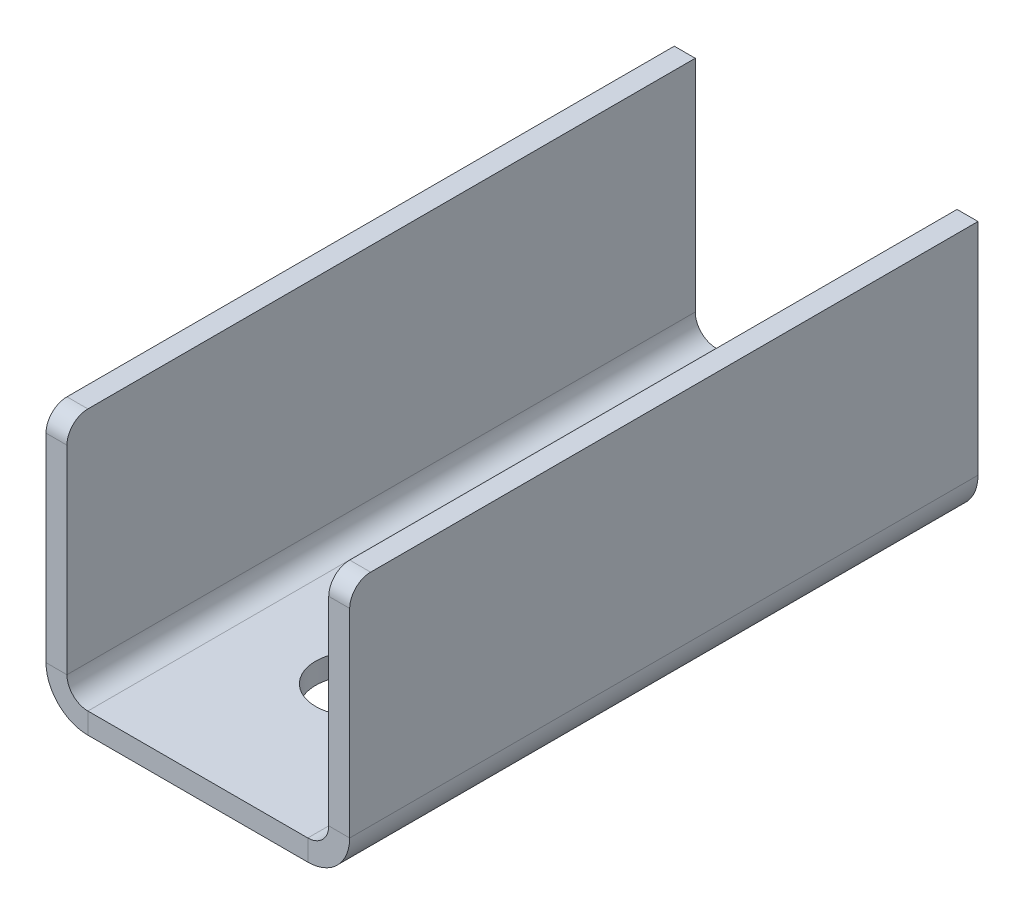
ISO-10303-21;
HEADER;
FILE_DESCRIPTION(('STEP AP214'),'2;1');
FILE_NAME('part.step','',(''),(''),'','','');
FILE_SCHEMA(('AUTOMOTIVE_DESIGN { 1 0 10303 214 1 1 1 1 }'));
ENDSEC;
DATA;
#1=APPLICATION_CONTEXT('core data for automotive mechanical design processes');
#2=APPLICATION_PROTOCOL_DEFINITION('international standard','automotive_design',2000,#1);
#3=PRODUCT_CONTEXT('',#1,'mechanical');
#4=PRODUCT('Part','Part','',(#3));
#5=PRODUCT_RELATED_PRODUCT_CATEGORY('part','',(#4));
#6=PRODUCT_DEFINITION_FORMATION('','',#4);
#7=PRODUCT_DEFINITION_CONTEXT('part definition',#1,'design');
#8=PRODUCT_DEFINITION('design','',#6,#7);
#9=PRODUCT_DEFINITION_SHAPE('','',#8);
#10=(LENGTH_UNIT() NAMED_UNIT(*) SI_UNIT(.MILLI.,.METRE.));
#11=(NAMED_UNIT(*) PLANE_ANGLE_UNIT() SI_UNIT($,.RADIAN.));
#12=(NAMED_UNIT(*) SI_UNIT($,.STERADIAN.) SOLID_ANGLE_UNIT());
#13=UNCERTAINTY_MEASURE_WITH_UNIT(LENGTH_MEASURE(1.E-05),#10,'distance_accuracy_value','');
#14=(GEOMETRIC_REPRESENTATION_CONTEXT(3) GLOBAL_UNCERTAINTY_ASSIGNED_CONTEXT((#13)) GLOBAL_UNIT_ASSIGNED_CONTEXT((#10,
#11,#12)) REPRESENTATION_CONTEXT('',''));
#15=CARTESIAN_POINT('',(0.,0.,0.));
#16=DIRECTION('',(0.,0.,1.));
#17=DIRECTION('',(1.,0.,0.));
#18=AXIS2_PLACEMENT_3D('',#15,#16,#17);
#19=CARTESIAN_POINT('',(-14.5,4.21884749357559E-12,60.));
#20=DIRECTION('',(0.,0.,1.));
#21=DIRECTION('',(1.,0.,0.));
#22=AXIS2_PLACEMENT_3D('',#19,#20,#21);
#23=PLANE('',#22);
#24=DIRECTION('',(0.,-1.,0.));
#25=VECTOR('',#24,1.);
#26=CARTESIAN_POINT('',(10.5,4.21884749357559E-12,60.));
#27=LINE('',#26,#25);
#28=CARTESIAN_POINT('',(10.5,2.00000000000422,60.));
#29=VERTEX_POINT('',#28);
#30=CARTESIAN_POINT('',(10.5,4.21884749357559E-12,60.));
#31=VERTEX_POINT('',#30);
#32=EDGE_CURVE('E260',#29,#31,#27,.T.);
#33=ORIENTED_EDGE('',*,*,#32,.F.);
#34=DIRECTION('',(1.,0.,0.));
#35=VECTOR('',#34,1.);
#36=CARTESIAN_POINT('',(-14.5,2.00000000000422,60.));
#37=LINE('',#36,#35);
#38=CARTESIAN_POINT('',(-10.5,2.00000000000422,60.));
#39=VERTEX_POINT('',#38);
#40=EDGE_CURVE('E230',#39,#29,#37,.T.);
#41=ORIENTED_EDGE('',*,*,#40,.F.);
#42=DIRECTION('',(0.,-1.,0.));
#43=VECTOR('',#42,1.);
#44=CARTESIAN_POINT('',(-10.5,4.21884749357559E-12,60.));
#45=LINE('',#44,#43);
#46=CARTESIAN_POINT('',(-10.5,4.21884749357559E-12,60.));
#47=VERTEX_POINT('',#46);
#48=EDGE_CURVE('E258',#39,#47,#45,.T.);
#49=ORIENTED_EDGE('',*,*,#48,.T.);
#50=DIRECTION('',(1.,0.,0.));
#51=VECTOR('',#50,1.);
#52=CARTESIAN_POINT('',(-14.5,4.21884749357559E-12,60.));
#53=LINE('',#52,#51);
#54=EDGE_CURVE('E165',#47,#31,#53,.T.);
#55=ORIENTED_EDGE('',*,*,#54,.T.);
#56=EDGE_LOOP('',(#33,#41,#49,#55));
#57=FACE_BOUND('',#56,.T.);
#58=ADVANCED_FACE('F38',(#57),#23,.T.);
#59=CARTESIAN_POINT('',(-10.5,4.00000000000422,60.));
#60=DIRECTION('',(0.,0.,-1.));
#61=DIRECTION('',(-1.,0.,0.));
#62=AXIS2_PLACEMENT_3D('',#59,#60,#61);
#63=PLANE('',#62);
#64=ORIENTED_EDGE('',*,*,#48,.F.);
#65=CARTESIAN_POINT('',(-10.5,4.00000000000422,60.));
#66=DIRECTION('',(0.,0.,-1.));
#67=DIRECTION('',(-1.,0.,0.));
#68=AXIS2_PLACEMENT_3D('',#65,#66,#67);
#69=CIRCLE('',#68,2.);
#70=CARTESIAN_POINT('',(-12.5,4.00000000000422,60.));
#71=VERTEX_POINT('',#70);
#72=EDGE_CURVE('E231',#39,#71,#69,.T.);
#73=ORIENTED_EDGE('',*,*,#72,.T.);
#74=DIRECTION('',(-1.,0.,0.));
#75=VECTOR('',#74,1.);
#76=CARTESIAN_POINT('',(-14.5,4.00000000000422,60.));
#77=LINE('',#76,#75);
#78=CARTESIAN_POINT('',(-14.5,4.00000000000422,60.));
#79=VERTEX_POINT('',#78);
#80=EDGE_CURVE('E161',#71,#79,#77,.T.);
#81=ORIENTED_EDGE('',*,*,#80,.T.);
#82=CARTESIAN_POINT('',(-10.5,4.00000000000422,60.));
#83=DIRECTION('',(0.,0.,1.));
#84=DIRECTION('',(1.,0.,0.));
#85=AXIS2_PLACEMENT_3D('',#82,#83,#84);
#86=CIRCLE('',#85,4.);
#87=EDGE_CURVE('E188',#47,#79,#86,.F.);
#88=ORIENTED_EDGE('',*,*,#87,.F.);
#89=EDGE_LOOP('',(#64,#73,#81,#88));
#90=FACE_BOUND('',#89,.T.);
#91=ADVANCED_FACE('F323',(#90),#63,.F.);
#92=CARTESIAN_POINT('',(-14.5,24.9834797239143,60.));
#93=DIRECTION('',(0.,0.,1.));
#94=DIRECTION('',(0.,-1.,0.));
#95=AXIS2_PLACEMENT_3D('',#92,#93,#94);
#96=PLANE('',#95);
#97=DIRECTION('',(0.,1.,0.));
#98=VECTOR('',#97,1.);
#99=CARTESIAN_POINT('',(-12.5,24.9834797239143,60.));
#100=LINE('',#99,#98);
#101=CARTESIAN_POINT('',(-12.5,22.9834797239143,60.));
#102=VERTEX_POINT('',#101);
#103=EDGE_CURVE('E237',#102,#71,#100,.F.);
#104=ORIENTED_EDGE('',*,*,#103,.F.);
#105=DIRECTION('',(1.,0.,0.));
#106=VECTOR('',#105,1.);
#107=CARTESIAN_POINT('',(-14.5,22.9834797239143,60.));
#108=LINE('',#107,#106);
#109=CARTESIAN_POINT('',(-14.5,22.9834797239143,60.));
#110=VERTEX_POINT('',#109);
#111=EDGE_CURVE('E262',#102,#110,#108,.F.);
#112=ORIENTED_EDGE('',*,*,#111,.T.);
#113=DIRECTION('',(0.,-1.,0.));
#114=VECTOR('',#113,1.);
#115=CARTESIAN_POINT('',(-14.5,24.9834797239143,60.));
#116=LINE('',#115,#114);
#117=EDGE_CURVE('E151',#110,#79,#116,.T.);
#118=ORIENTED_EDGE('',*,*,#117,.T.);
#119=ORIENTED_EDGE('',*,*,#80,.F.);
#120=EDGE_LOOP('',(#104,#112,#118,#119));
#121=FACE_BOUND('',#120,.T.);
#122=ADVANCED_FACE('F320',(#121),#96,.T.);
#123=CARTESIAN_POINT('',(-14.5,24.9834797239143,60.));
#124=DIRECTION('',(0.,-1.,0.));
#125=DIRECTION('',(0.,0.,-1.));
#126=AXIS2_PLACEMENT_3D('',#123,#124,#125);
#127=PLANE('',#126);
#128=DIRECTION('',(0.,0.,-1.));
#129=VECTOR('',#128,1.);
#130=CARTESIAN_POINT('',(-14.5,24.9834797239143,60.));
#131=LINE('',#130,#129);
#132=CARTESIAN_POINT('',(-14.5,24.9834797239143,58.));
#133=VERTEX_POINT('',#132);
#134=CARTESIAN_POINT('',(-14.5,24.9834797239143,0.));
#135=VERTEX_POINT('',#134);
#136=EDGE_CURVE('E139',#133,#135,#131,.T.);
#137=ORIENTED_EDGE('',*,*,#136,.F.);
#138=DIRECTION('',(-1.,0.,0.));
#139=VECTOR('',#138,1.);
#140=CARTESIAN_POINT('',(-14.5,24.9834797239143,58.));
#141=LINE('',#140,#139);
#142=CARTESIAN_POINT('',(-12.5,24.9834797239143,58.));
#143=VERTEX_POINT('',#142);
#144=EDGE_CURVE('E267',#133,#143,#141,.F.);
#145=ORIENTED_EDGE('',*,*,#144,.T.);
#146=DIRECTION('',(0.,0.,1.));
#147=VECTOR('',#146,1.);
#148=CARTESIAN_POINT('',(-12.5,24.9834797239143,60.));
#149=LINE('',#148,#147);
#150=CARTESIAN_POINT('',(-12.5,24.9834797239143,0.));
#151=VERTEX_POINT('',#150);
#152=EDGE_CURVE('E157',#143,#151,#149,.F.);
#153=ORIENTED_EDGE('',*,*,#152,.T.);
#154=DIRECTION('',(-1.,0.,0.));
#155=VECTOR('',#154,1.);
#156=CARTESIAN_POINT('',(-14.5,24.9834797239143,0.));
#157=LINE('',#156,#155);
#158=EDGE_CURVE('E154',#151,#135,#157,.T.);
#159=ORIENTED_EDGE('',*,*,#158,.T.);
#160=EDGE_LOOP('',(#137,#145,#153,#159));
#161=FACE_BOUND('',#160,.T.);
#162=ADVANCED_FACE('F155',(#161),#127,.F.);
#163=CARTESIAN_POINT('',(-14.5,24.9834797239143,0.));
#164=DIRECTION('',(0.,0.,1.));
#165=DIRECTION('',(0.,-1.,0.));
#166=AXIS2_PLACEMENT_3D('',#163,#164,#165);
#167=PLANE('',#166);
#168=ORIENTED_EDGE('',*,*,#158,.F.);
#169=DIRECTION('',(0.,1.,0.));
#170=VECTOR('',#169,1.);
#171=CARTESIAN_POINT('',(-12.5,24.9834797239143,0.));
#172=LINE('',#171,#170);
#173=CARTESIAN_POINT('',(-12.5,4.00000000000422,0.));
#174=VERTEX_POINT('',#173);
#175=EDGE_CURVE('E235',#151,#174,#172,.F.);
#176=ORIENTED_EDGE('',*,*,#175,.T.);
#177=DIRECTION('',(-1.,0.,0.));
#178=VECTOR('',#177,1.);
#179=CARTESIAN_POINT('',(-14.5,4.00000000000422,0.));
#180=LINE('',#179,#178);
#181=CARTESIAN_POINT('',(-14.5,4.00000000000422,0.));
#182=VERTEX_POINT('',#181);
#183=EDGE_CURVE('E162',#174,#182,#180,.T.);
#184=ORIENTED_EDGE('',*,*,#183,.T.);
#185=DIRECTION('',(0.,-1.,0.));
#186=VECTOR('',#185,1.);
#187=CARTESIAN_POINT('',(-14.5,24.9834797239143,0.));
#188=LINE('',#187,#186);
#189=EDGE_CURVE('E145',#135,#182,#188,.T.);
#190=ORIENTED_EDGE('',*,*,#189,.F.);
#191=EDGE_LOOP('',(#168,#176,#184,#190));
#192=FACE_BOUND('',#191,.T.);
#193=ADVANCED_FACE('F164',(#192),#167,.F.);
#194=CARTESIAN_POINT('',(-10.5,4.00000000000422,0.));
#195=DIRECTION('',(0.,0.,1.));
#196=DIRECTION('',(1.,0.,0.));
#197=AXIS2_PLACEMENT_3D('',#194,#195,#196);
#198=PLANE('',#197);
#199=ORIENTED_EDGE('',*,*,#183,.F.);
#200=CARTESIAN_POINT('',(-10.5,4.00000000000422,0.));
#201=DIRECTION('',(0.,0.,-1.));
#202=DIRECTION('',(-1.,0.,0.));
#203=AXIS2_PLACEMENT_3D('',#200,#201,#202);
#204=CIRCLE('',#203,2.);
#205=CARTESIAN_POINT('',(-10.5,2.00000000000422,0.));
#206=VERTEX_POINT('',#205);
#207=EDGE_CURVE('E232',#174,#206,#204,.F.);
#208=ORIENTED_EDGE('',*,*,#207,.T.);
#209=DIRECTION('',(0.,-1.,0.));
#210=VECTOR('',#209,1.);
#211=CARTESIAN_POINT('',(-10.5,4.21884749357559E-12,0.));
#212=LINE('',#211,#210);
#213=CARTESIAN_POINT('',(-10.5,4.21884749357559E-12,0.));
#214=VERTEX_POINT('',#213);
#215=EDGE_CURVE('E253',#206,#214,#212,.T.);
#216=ORIENTED_EDGE('',*,*,#215,.T.);
#217=CARTESIAN_POINT('',(-10.5,4.00000000000422,0.));
#218=DIRECTION('',(0.,0.,-1.));
#219=DIRECTION('',(-1.,0.,0.));
#220=AXIS2_PLACEMENT_3D('',#217,#218,#219);
#221=CIRCLE('',#220,4.);
#222=EDGE_CURVE('E185',#182,#214,#221,.F.);
#223=ORIENTED_EDGE('',*,*,#222,.F.);
#224=EDGE_LOOP('',(#199,#208,#216,#223));
#225=FACE_BOUND('',#224,.T.);
#226=ADVANCED_FACE('F309',(#225),#198,.F.);
#227=CARTESIAN_POINT('',(-14.5,4.21884749357559E-12,0.));
#228=DIRECTION('',(0.,0.,1.));
#229=DIRECTION('',(1.,0.,0.));
#230=AXIS2_PLACEMENT_3D('',#227,#228,#229);
#231=PLANE('',#230);
#232=ORIENTED_EDGE('',*,*,#215,.F.);
#233=DIRECTION('',(1.,0.,0.));
#234=VECTOR('',#233,1.);
#235=CARTESIAN_POINT('',(-14.5,2.00000000000422,0.));
#236=LINE('',#235,#234);
#237=CARTESIAN_POINT('',(10.5,2.00000000000422,0.));
#238=VERTEX_POINT('',#237);
#239=EDGE_CURVE('E227',#206,#238,#236,.T.);
#240=ORIENTED_EDGE('',*,*,#239,.T.);
#241=DIRECTION('',(0.,-1.,0.));
#242=VECTOR('',#241,1.);
#243=CARTESIAN_POINT('',(10.5,4.21884749357559E-12,0.));
#244=LINE('',#243,#242);
#245=CARTESIAN_POINT('',(10.5,4.21884749357559E-12,0.));
#246=VERTEX_POINT('',#245);
#247=EDGE_CURVE('E251',#238,#246,#244,.T.);
#248=ORIENTED_EDGE('',*,*,#247,.T.);
#249=DIRECTION('',(1.,0.,0.));
#250=VECTOR('',#249,1.);
#251=CARTESIAN_POINT('',(-14.5,4.21884749357559E-12,0.));
#252=LINE('',#251,#250);
#253=EDGE_CURVE('E169',#214,#246,#252,.T.);
#254=ORIENTED_EDGE('',*,*,#253,.F.);
#255=EDGE_LOOP('',(#232,#240,#248,#254));
#256=FACE_BOUND('',#255,.T.);
#257=ADVANCED_FACE('F300',(#256),#231,.F.);
#258=CARTESIAN_POINT('',(10.5,4.00000000000422,0.));
#259=DIRECTION('',(0.,0.,1.));
#260=DIRECTION('',(1.,0.,0.));
#261=AXIS2_PLACEMENT_3D('',#258,#259,#260);
#262=PLANE('',#261);
#263=ORIENTED_EDGE('',*,*,#247,.F.);
#264=CARTESIAN_POINT('',(10.5,4.00000000000422,0.));
#265=DIRECTION('',(0.,0.,-1.));
#266=DIRECTION('',(-1.,0.,0.));
#267=AXIS2_PLACEMENT_3D('',#264,#265,#266);
#268=CIRCLE('',#267,2.);
#269=CARTESIAN_POINT('',(12.5,4.00000000000422,0.));
#270=VERTEX_POINT('',#269);
#271=EDGE_CURVE('E222',#238,#270,#268,.F.);
#272=ORIENTED_EDGE('',*,*,#271,.T.);
#273=DIRECTION('',(1.,0.,0.));
#274=VECTOR('',#273,1.);
#275=CARTESIAN_POINT('',(14.5,4.00000000000422,0.));
#276=LINE('',#275,#274);
#277=CARTESIAN_POINT('',(14.5,4.00000000000422,0.));
#278=VERTEX_POINT('',#277);
#279=EDGE_CURVE('E249',#270,#278,#276,.T.);
#280=ORIENTED_EDGE('',*,*,#279,.T.);
#281=CARTESIAN_POINT('',(10.5,4.00000000000422,0.));
#282=DIRECTION('',(0.,0.,-1.));
#283=DIRECTION('',(-1.,0.,0.));
#284=AXIS2_PLACEMENT_3D('',#281,#282,#283);
#285=CIRCLE('',#284,4.);
#286=EDGE_CURVE('E198',#246,#278,#285,.F.);
#287=ORIENTED_EDGE('',*,*,#286,.F.);
#288=EDGE_LOOP('',(#263,#272,#280,#287));
#289=FACE_BOUND('',#288,.T.);
#290=ADVANCED_FACE('F293',(#289),#262,.F.);
#291=CARTESIAN_POINT('',(14.5,4.21884749357559E-12,0.));
#292=DIRECTION('',(0.,0.,1.));
#293=DIRECTION('',(0.,1.,0.));
#294=AXIS2_PLACEMENT_3D('',#291,#292,#293);
#295=PLANE('',#294);
#296=ORIENTED_EDGE('',*,*,#279,.F.);
#297=DIRECTION('',(0.,-1.,0.));
#298=VECTOR('',#297,1.);
#299=CARTESIAN_POINT('',(12.5,4.21870862393092E-12,0.));
#300=LINE('',#299,#298);
#301=CARTESIAN_POINT('',(12.5,24.9834797239143,0.));
#302=VERTEX_POINT('',#301);
#303=EDGE_CURVE('E219',#270,#302,#300,.F.);
#304=ORIENTED_EDGE('',*,*,#303,.T.);
#305=DIRECTION('',(1.,0.,0.));
#306=VECTOR('',#305,1.);
#307=CARTESIAN_POINT('',(14.5,24.9834797239143,0.));
#308=LINE('',#307,#306);
#309=CARTESIAN_POINT('',(14.5,24.9834797239143,0.));
#310=VERTEX_POINT('',#309);
#311=EDGE_CURVE('E246',#302,#310,#308,.T.);
#312=ORIENTED_EDGE('',*,*,#311,.T.);
#313=DIRECTION('',(0.,1.,0.));
#314=VECTOR('',#313,1.);
#315=CARTESIAN_POINT('',(14.5,4.21884749357559E-12,0.));
#316=LINE('',#315,#314);
#317=EDGE_CURVE('E150',#278,#310,#316,.T.);
#318=ORIENTED_EDGE('',*,*,#317,.F.);
#319=EDGE_LOOP('',(#296,#304,#312,#318));
#320=FACE_BOUND('',#319,.T.);
#321=ADVANCED_FACE('F285',(#320),#295,.F.);
#322=CARTESIAN_POINT('',(14.5,24.9834797239143,60.));
#323=DIRECTION('',(0.,1.,0.));
#324=DIRECTION('',(0.,0.,-1.));
#325=AXIS2_PLACEMENT_3D('',#322,#323,#324);
#326=PLANE('',#325);
#327=DIRECTION('',(0.,0.,1.));
#328=VECTOR('',#327,1.);
#329=CARTESIAN_POINT('',(12.5,24.9834797239143,60.));
#330=LINE('',#329,#328);
#331=CARTESIAN_POINT('',(12.5,24.9834797239143,58.));
#332=VERTEX_POINT('',#331);
#333=EDGE_CURVE('E217',#332,#302,#330,.F.);
#334=ORIENTED_EDGE('',*,*,#333,.F.);
#335=DIRECTION('',(1.,0.,0.));
#336=VECTOR('',#335,1.);
#337=CARTESIAN_POINT('',(14.5,24.9834797239143,58.));
#338=LINE('',#337,#336);
#339=CARTESIAN_POINT('',(14.5,24.9834797239143,58.));
#340=VERTEX_POINT('',#339);
#341=EDGE_CURVE('E271',#332,#340,#338,.T.);
#342=ORIENTED_EDGE('',*,*,#341,.T.);
#343=DIRECTION('',(0.,0.,-1.));
#344=VECTOR('',#343,1.);
#345=CARTESIAN_POINT('',(14.5,24.9834797239143,60.));
#346=LINE('',#345,#344);
#347=EDGE_CURVE('E175',#340,#310,#346,.T.);
#348=ORIENTED_EDGE('',*,*,#347,.T.);
#349=ORIENTED_EDGE('',*,*,#311,.F.);
#350=EDGE_LOOP('',(#334,#342,#348,#349));
#351=FACE_BOUND('',#350,.T.);
#352=ADVANCED_FACE('F277',(#351),#326,.T.);
#353=CARTESIAN_POINT('',(14.5,4.21884749357559E-12,60.));
#354=DIRECTION('',(0.,0.,1.));
#355=DIRECTION('',(0.,1.,0.));
#356=AXIS2_PLACEMENT_3D('',#353,#354,#355);
#357=PLANE('',#356);
#358=DIRECTION('',(0.,1.,0.));
#359=VECTOR('',#358,1.);
#360=CARTESIAN_POINT('',(14.5,4.21884749357559E-12,60.));
#361=LINE('',#360,#359);
#362=CARTESIAN_POINT('',(14.5,4.00000000000422,60.));
#363=VERTEX_POINT('',#362);
#364=CARTESIAN_POINT('',(14.5,22.9834797239143,60.));
#365=VERTEX_POINT('',#364);
#366=EDGE_CURVE('E177',#363,#365,#361,.T.);
#367=ORIENTED_EDGE('',*,*,#366,.T.);
#368=DIRECTION('',(1.,0.,0.));
#369=VECTOR('',#368,1.);
#370=CARTESIAN_POINT('',(14.5,22.9834797239143,60.));
#371=LINE('',#370,#369);
#372=CARTESIAN_POINT('',(12.5,22.9834797239143,60.));
#373=VERTEX_POINT('',#372);
#374=EDGE_CURVE('E46',#365,#373,#371,.F.);
#375=ORIENTED_EDGE('',*,*,#374,.T.);
#376=DIRECTION('',(0.,-1.,0.));
#377=VECTOR('',#376,1.);
#378=CARTESIAN_POINT('',(12.5,4.21870862393092E-12,60.));
#379=LINE('',#378,#377);
#380=CARTESIAN_POINT('',(12.5,4.00000000000422,60.));
#381=VERTEX_POINT('',#380);
#382=EDGE_CURVE('E213',#381,#373,#379,.F.);
#383=ORIENTED_EDGE('',*,*,#382,.F.);
#384=DIRECTION('',(1.,0.,0.));
#385=VECTOR('',#384,1.);
#386=CARTESIAN_POINT('',(14.5,4.00000000000422,60.));
#387=LINE('',#386,#385);
#388=EDGE_CURVE('E197',#381,#363,#387,.T.);
#389=ORIENTED_EDGE('',*,*,#388,.T.);
#390=EDGE_LOOP('',(#367,#375,#383,#389));
#391=FACE_BOUND('',#390,.T.);
#392=ADVANCED_FACE('F337',(#391),#357,.T.);
#393=CARTESIAN_POINT('',(10.5,4.00000000000422,60.));
#394=DIRECTION('',(0.,0.,-1.));
#395=DIRECTION('',(-1.,0.,0.));
#396=AXIS2_PLACEMENT_3D('',#393,#394,#395);
#397=PLANE('',#396);
#398=CARTESIAN_POINT('',(10.5,4.00000000000422,60.));
#399=DIRECTION('',(0.,0.,-1.));
#400=DIRECTION('',(-1.,0.,0.));
#401=AXIS2_PLACEMENT_3D('',#398,#399,#400);
#402=CIRCLE('',#401,2.);
#403=EDGE_CURVE('E225',#381,#29,#402,.T.);
#404=ORIENTED_EDGE('',*,*,#403,.T.);
#405=ORIENTED_EDGE('',*,*,#32,.T.);
#406=CARTESIAN_POINT('',(10.5,4.00000000000422,60.));
#407=DIRECTION('',(0.,0.,1.));
#408=DIRECTION('',(1.,0.,0.));
#409=AXIS2_PLACEMENT_3D('',#406,#407,#408);
#410=CIRCLE('',#409,4.);
#411=EDGE_CURVE('E189',#363,#31,#410,.F.);
#412=ORIENTED_EDGE('',*,*,#411,.F.);
#413=ORIENTED_EDGE('',*,*,#388,.F.);
#414=EDGE_LOOP('',(#404,#405,#412,#413));
#415=FACE_BOUND('',#414,.T.);
#416=ADVANCED_FACE('F335',(#415),#397,.F.);
#417=CARTESIAN_POINT('',(14.5,4.21884749357559E-12,60.));
#418=DIRECTION('',(-1.,0.,0.));
#419=DIRECTION('',(0.,-1.,0.));
#420=AXIS2_PLACEMENT_3D('',#417,#418,#419);
#421=PLANE('',#420);
#422=ORIENTED_EDGE('',*,*,#347,.F.);
#423=CARTESIAN_POINT('',(14.5,22.9834797239143,58.));
#424=DIRECTION('',(-1.,0.,0.));
#425=DIRECTION('',(0.,-1.,0.));
#426=AXIS2_PLACEMENT_3D('',#423,#424,#425);
#427=CIRCLE('',#426,2.);
#428=EDGE_CURVE('E60',#340,#365,#427,.F.);
#429=ORIENTED_EDGE('',*,*,#428,.T.);
#430=ORIENTED_EDGE('',*,*,#366,.F.);
#431=DIRECTION('',(0.,0.,-1.));
#432=VECTOR('',#431,1.);
#433=CARTESIAN_POINT('',(14.5,4.00000000000422,60.));
#434=LINE('',#433,#432);
#435=EDGE_CURVE('E184',#363,#278,#434,.T.);
#436=ORIENTED_EDGE('',*,*,#435,.T.);
#437=ORIENTED_EDGE('',*,*,#317,.T.);
#438=EDGE_LOOP('',(#422,#429,#430,#436,#437));
#439=FACE_BOUND('',#438,.T.);
#440=ADVANCED_FACE('F281',(#439),#421,.F.);
#441=CARTESIAN_POINT('',(-14.5,24.9834797239143,60.));
#442=DIRECTION('',(1.,0.,0.));
#443=DIRECTION('',(0.,1.,0.));
#444=AXIS2_PLACEMENT_3D('',#441,#442,#443);
#445=PLANE('',#444);
#446=ORIENTED_EDGE('',*,*,#117,.F.);
#447=CARTESIAN_POINT('',(-14.5,22.9834797239143,58.));
#448=DIRECTION('',(1.,0.,0.));
#449=DIRECTION('',(0.,1.,0.));
#450=AXIS2_PLACEMENT_3D('',#447,#448,#449);
#451=CIRCLE('',#450,2.);
#452=EDGE_CURVE('E147',#110,#133,#451,.F.);
#453=ORIENTED_EDGE('',*,*,#452,.T.);
#454=ORIENTED_EDGE('',*,*,#136,.T.);
#455=ORIENTED_EDGE('',*,*,#189,.T.);
#456=DIRECTION('',(0.,0.,-1.));
#457=VECTOR('',#456,1.);
#458=CARTESIAN_POINT('',(-14.5,4.00000000000422,60.));
#459=LINE('',#458,#457);
#460=EDGE_CURVE('E182',#182,#79,#459,.F.);
#461=ORIENTED_EDGE('',*,*,#460,.T.);
#462=EDGE_LOOP('',(#446,#453,#454,#455,#461));
#463=FACE_BOUND('',#462,.T.);
#464=ADVANCED_FACE('F142',(#463),#445,.F.);
#465=CARTESIAN_POINT('',(-14.5,4.21884749357559E-12,60.));
#466=DIRECTION('',(0.,1.,0.));
#467=DIRECTION('',(0.,0.,1.));
#468=AXIS2_PLACEMENT_3D('',#465,#466,#467);
#469=PLANE('',#468);
#470=CARTESIAN_POINT('',(0.,0.,45.));
#471=DIRECTION('',(0.,-1.,0.));
#472=DIRECTION('',(0.,0.,-1.));
#473=AXIS2_PLACEMENT_3D('',#470,#471,#472);
#474=CIRCLE('',#473,3.75);
#475=CARTESIAN_POINT('',(0.,0.,41.25));
#476=VERTEX_POINT('',#475);
#477=EDGE_CURVE('E226',#476,#476,#474,.T.);
#478=ORIENTED_EDGE('',*,*,#477,.F.);
#479=EDGE_LOOP('',(#478));
#480=FACE_BOUND('',#479,.T.);
#481=CARTESIAN_POINT('',(0.,0.,15.));
#482=DIRECTION('',(0.,-1.,0.));
#483=DIRECTION('',(0.,0.,-1.));
#484=AXIS2_PLACEMENT_3D('',#481,#482,#483);
#485=CIRCLE('',#484,3.75);
#486=CARTESIAN_POINT('',(0.,0.,11.25));
#487=VERTEX_POINT('',#486);
#488=EDGE_CURVE('E549',#487,#487,#485,.T.);
#489=ORIENTED_EDGE('',*,*,#488,.F.);
#490=EDGE_LOOP('',(#489));
#491=FACE_BOUND('',#490,.T.);
#492=ORIENTED_EDGE('',*,*,#253,.T.);
#493=DIRECTION('',(0.,0.,-1.));
#494=VECTOR('',#493,1.);
#495=CARTESIAN_POINT('',(10.5,4.21884749357559E-12,60.));
#496=LINE('',#495,#494);
#497=EDGE_CURVE('E194',#246,#31,#496,.F.);
#498=ORIENTED_EDGE('',*,*,#497,.T.);
#499=ORIENTED_EDGE('',*,*,#54,.F.);
#500=DIRECTION('',(0.,0.,-1.));
#501=VECTOR('',#500,1.);
#502=CARTESIAN_POINT('',(-10.5,4.21884749357559E-12,60.));
#503=LINE('',#502,#501);
#504=EDGE_CURVE('E179',#47,#214,#503,.T.);
#505=ORIENTED_EDGE('',*,*,#504,.T.);
#506=EDGE_LOOP('',(#492,#498,#499,#505));
#507=FACE_BOUND('',#506,.T.);
#508=ADVANCED_FACE('F330',(#480,#491,#507),#469,.F.);
#509=CARTESIAN_POINT('',(-10.5,4.00000000000422,60.));
#510=DIRECTION('',(0.,0.,-1.));
#511=DIRECTION('',(-1.,0.,0.));
#512=AXIS2_PLACEMENT_3D('',#509,#510,#511);
#513=CYLINDRICAL_SURFACE('',#512,4.);
#514=ORIENTED_EDGE('',*,*,#87,.T.);
#515=ORIENTED_EDGE('',*,*,#460,.F.);
#516=ORIENTED_EDGE('',*,*,#222,.T.);
#517=ORIENTED_EDGE('',*,*,#504,.F.);
#518=EDGE_LOOP('',(#514,#515,#516,#517));
#519=FACE_BOUND('',#518,.T.);
#520=ADVANCED_FACE('F327',(#519),#513,.T.);
#521=CARTESIAN_POINT('',(10.5,4.00000000000422,60.));
#522=DIRECTION('',(0.,0.,-1.));
#523=DIRECTION('',(-1.,0.,0.));
#524=AXIS2_PLACEMENT_3D('',#521,#522,#523);
#525=CYLINDRICAL_SURFACE('',#524,4.);
#526=ORIENTED_EDGE('',*,*,#411,.T.);
#527=ORIENTED_EDGE('',*,*,#497,.F.);
#528=ORIENTED_EDGE('',*,*,#286,.T.);
#529=ORIENTED_EDGE('',*,*,#435,.F.);
#530=EDGE_LOOP('',(#526,#527,#528,#529));
#531=FACE_BOUND('',#530,.T.);
#532=ADVANCED_FACE('F453',(#531),#525,.T.);
#533=CARTESIAN_POINT('',(12.5,4.21870862393092E-12,60.));
#534=DIRECTION('',(-1.,0.,0.));
#535=DIRECTION('',(0.,-1.,0.));
#536=AXIS2_PLACEMENT_3D('',#533,#534,#535);
#537=PLANE('',#536);
#538=ORIENTED_EDGE('',*,*,#382,.T.);
#539=CARTESIAN_POINT('',(12.5,22.9834797239143,58.));
#540=DIRECTION('',(-1.,0.,0.));
#541=DIRECTION('',(0.,-1.,0.));
#542=AXIS2_PLACEMENT_3D('',#539,#540,#541);
#543=CIRCLE('',#542,2.);
#544=EDGE_CURVE('E11',#373,#332,#543,.T.);
#545=ORIENTED_EDGE('',*,*,#544,.T.);
#546=ORIENTED_EDGE('',*,*,#333,.T.);
#547=ORIENTED_EDGE('',*,*,#303,.F.);
#548=DIRECTION('',(0.,0.,1.));
#549=VECTOR('',#548,1.);
#550=CARTESIAN_POINT('',(12.5,4.00000000000422,60.));
#551=LINE('',#550,#549);
#552=EDGE_CURVE('E204',#381,#270,#551,.F.);
#553=ORIENTED_EDGE('',*,*,#552,.F.);
#554=EDGE_LOOP('',(#538,#545,#546,#547,#553));
#555=FACE_BOUND('',#554,.T.);
#556=ADVANCED_FACE('F289',(#555),#537,.T.);
#557=CARTESIAN_POINT('',(-12.5,24.9834797239143,60.));
#558=DIRECTION('',(1.,0.,0.));
#559=DIRECTION('',(0.,1.,0.));
#560=AXIS2_PLACEMENT_3D('',#557,#558,#559);
#561=PLANE('',#560);
#562=ORIENTED_EDGE('',*,*,#152,.F.);
#563=CARTESIAN_POINT('',(-12.5,22.9834797239143,58.));
#564=DIRECTION('',(1.,0.,0.));
#565=DIRECTION('',(0.,1.,0.));
#566=AXIS2_PLACEMENT_3D('',#563,#564,#565);
#567=CIRCLE('',#566,2.);
#568=EDGE_CURVE('E269',#143,#102,#567,.T.);
#569=ORIENTED_EDGE('',*,*,#568,.T.);
#570=ORIENTED_EDGE('',*,*,#103,.T.);
#571=DIRECTION('',(0.,0.,1.));
#572=VECTOR('',#571,1.);
#573=CARTESIAN_POINT('',(-12.5,4.00000000000422,60.));
#574=LINE('',#573,#572);
#575=EDGE_CURVE('E207',#174,#71,#574,.T.);
#576=ORIENTED_EDGE('',*,*,#575,.F.);
#577=ORIENTED_EDGE('',*,*,#175,.F.);
#578=EDGE_LOOP('',(#562,#569,#570,#576,#577));
#579=FACE_BOUND('',#578,.T.);
#580=ADVANCED_FACE('F314',(#579),#561,.T.);
#581=CARTESIAN_POINT('',(-14.5,2.00000000000422,60.));
#582=DIRECTION('',(0.,1.,0.));
#583=DIRECTION('',(0.,0.,1.));
#584=AXIS2_PLACEMENT_3D('',#581,#582,#583);
#585=PLANE('',#584);
#586=CARTESIAN_POINT('',(0.,2.00000000000422,45.));
#587=DIRECTION('',(0.,1.,0.));
#588=DIRECTION('',(0.,0.,1.));
#589=AXIS2_PLACEMENT_3D('',#586,#587,#588);
#590=CIRCLE('',#589,3.75);
#591=CARTESIAN_POINT('',(0.,2.00000000000422,48.75));
#592=VERTEX_POINT('',#591);
#593=EDGE_CURVE('E545',#592,#592,#590,.F.);
#594=ORIENTED_EDGE('',*,*,#593,.T.);
#595=EDGE_LOOP('',(#594));
#596=FACE_BOUND('',#595,.T.);
#597=CARTESIAN_POINT('',(0.,2.00000000000422,15.));
#598=DIRECTION('',(0.,1.,0.));
#599=DIRECTION('',(0.,0.,1.));
#600=AXIS2_PLACEMENT_3D('',#597,#598,#599);
#601=CIRCLE('',#600,3.75);
#602=CARTESIAN_POINT('',(0.,2.00000000000422,18.75));
#603=VERTEX_POINT('',#602);
#604=EDGE_CURVE('E554',#603,#603,#601,.F.);
#605=ORIENTED_EDGE('',*,*,#604,.T.);
#606=EDGE_LOOP('',(#605));
#607=FACE_BOUND('',#606,.T.);
#608=ORIENTED_EDGE('',*,*,#239,.F.);
#609=DIRECTION('',(0.,0.,1.));
#610=VECTOR('',#609,1.);
#611=CARTESIAN_POINT('',(-10.5,2.00000000000422,60.));
#612=LINE('',#611,#610);
#613=EDGE_CURVE('E210',#39,#206,#612,.F.);
#614=ORIENTED_EDGE('',*,*,#613,.F.);
#615=ORIENTED_EDGE('',*,*,#40,.T.);
#616=DIRECTION('',(0.,0.,1.));
#617=VECTOR('',#616,1.);
#618=CARTESIAN_POINT('',(10.5,2.00000000000422,60.));
#619=LINE('',#618,#617);
#620=EDGE_CURVE('E201',#238,#29,#619,.T.);
#621=ORIENTED_EDGE('',*,*,#620,.F.);
#622=EDGE_LOOP('',(#608,#614,#615,#621));
#623=FACE_BOUND('',#622,.T.);
#624=ADVANCED_FACE('F305',(#596,#607,#623),#585,.T.);
#625=CARTESIAN_POINT('',(-10.5,4.00000000000422,60.));
#626=DIRECTION('',(0.,0.,-1.));
#627=DIRECTION('',(-1.,0.,0.));
#628=AXIS2_PLACEMENT_3D('',#625,#626,#627);
#629=CYLINDRICAL_SURFACE('',#628,2.);
#630=ORIENTED_EDGE('',*,*,#72,.F.);
#631=ORIENTED_EDGE('',*,*,#613,.T.);
#632=ORIENTED_EDGE('',*,*,#207,.F.);
#633=ORIENTED_EDGE('',*,*,#575,.T.);
#634=EDGE_LOOP('',(#630,#631,#632,#633));
#635=FACE_BOUND('',#634,.T.);
#636=ADVANCED_FACE('F312',(#635),#629,.F.);
#637=CARTESIAN_POINT('',(10.5,4.00000000000422,60.));
#638=DIRECTION('',(0.,0.,-1.));
#639=DIRECTION('',(-1.,0.,0.));
#640=AXIS2_PLACEMENT_3D('',#637,#638,#639);
#641=CYLINDRICAL_SURFACE('',#640,2.);
#642=ORIENTED_EDGE('',*,*,#403,.F.);
#643=ORIENTED_EDGE('',*,*,#552,.T.);
#644=ORIENTED_EDGE('',*,*,#271,.F.);
#645=ORIENTED_EDGE('',*,*,#620,.T.);
#646=EDGE_LOOP('',(#642,#643,#644,#645));
#647=FACE_BOUND('',#646,.T.);
#648=ADVANCED_FACE('F297',(#647),#641,.F.);
#649=CARTESIAN_POINT('',(0.,24.9844797239143,15.));
#650=DIRECTION('',(0.,-1.,0.));
#651=DIRECTION('',(0.,0.,-1.));
#652=AXIS2_PLACEMENT_3D('',#649,#650,#651);
#653=CYLINDRICAL_SURFACE('',#652,3.75);
#654=ORIENTED_EDGE('',*,*,#604,.F.);
#655=EDGE_LOOP('',(#654));
#656=FACE_BOUND('',#655,.T.);
#657=ORIENTED_EDGE('',*,*,#488,.T.);
#658=EDGE_LOOP('',(#657));
#659=FACE_BOUND('',#658,.T.);
#660=ADVANCED_FACE('F506',(#656,#659),#653,.F.);
#661=CARTESIAN_POINT('',(0.,24.9844797239143,45.));
#662=DIRECTION('',(0.,-1.,0.));
#663=DIRECTION('',(0.,0.,-1.));
#664=AXIS2_PLACEMENT_3D('',#661,#662,#663);
#665=CYLINDRICAL_SURFACE('',#664,3.75);
#666=ORIENTED_EDGE('',*,*,#593,.F.);
#667=EDGE_LOOP('',(#666));
#668=FACE_BOUND('',#667,.T.);
#669=ORIENTED_EDGE('',*,*,#477,.T.);
#670=EDGE_LOOP('',(#669));
#671=FACE_BOUND('',#670,.T.);
#672=ADVANCED_FACE('F343',(#668,#671),#665,.F.);
#673=CARTESIAN_POINT('',(-14.5,22.9834797239143,58.));
#674=DIRECTION('',(1.,0.,0.));
#675=DIRECTION('',(0.,1.,0.));
#676=AXIS2_PLACEMENT_3D('',#673,#674,#675);
#677=CYLINDRICAL_SURFACE('',#676,2.);
#678=ORIENTED_EDGE('',*,*,#568,.F.);
#679=ORIENTED_EDGE('',*,*,#144,.F.);
#680=ORIENTED_EDGE('',*,*,#452,.F.);
#681=ORIENTED_EDGE('',*,*,#111,.F.);
#682=EDGE_LOOP('',(#678,#679,#680,#681));
#683=FACE_BOUND('',#682,.T.);
#684=ADVANCED_FACE('F339',(#683),#677,.T.);
#685=CARTESIAN_POINT('',(14.5,22.9834797239143,58.));
#686=DIRECTION('',(1.,0.,0.));
#687=DIRECTION('',(0.,1.,0.));
#688=AXIS2_PLACEMENT_3D('',#685,#686,#687);
#689=CYLINDRICAL_SURFACE('',#688,2.);
#690=ORIENTED_EDGE('',*,*,#544,.F.);
#691=ORIENTED_EDGE('',*,*,#374,.F.);
#692=ORIENTED_EDGE('',*,*,#428,.F.);
#693=ORIENTED_EDGE('',*,*,#341,.F.);
#694=EDGE_LOOP('',(#690,#691,#692,#693));
#695=FACE_BOUND('',#694,.T.);
#696=ADVANCED_FACE('F40',(#695),#689,.T.);
#697=CLOSED_SHELL('',(#58,#91,#122,#162,#193,#226,#257,#290,#321,#352,#392,#416,#440,#464,#508,
#520,#532,#556,#580,#624,#636,#648,#660,#672,#684,#696));
#698=MANIFOLD_SOLID_BREP('B2',#697);
#699=ADVANCED_BREP_SHAPE_REPRESENTATION('',(#18,#698),#14);
#700=SHAPE_DEFINITION_REPRESENTATION(#9,#699);
ENDSEC;
END-ISO-10303-21;
